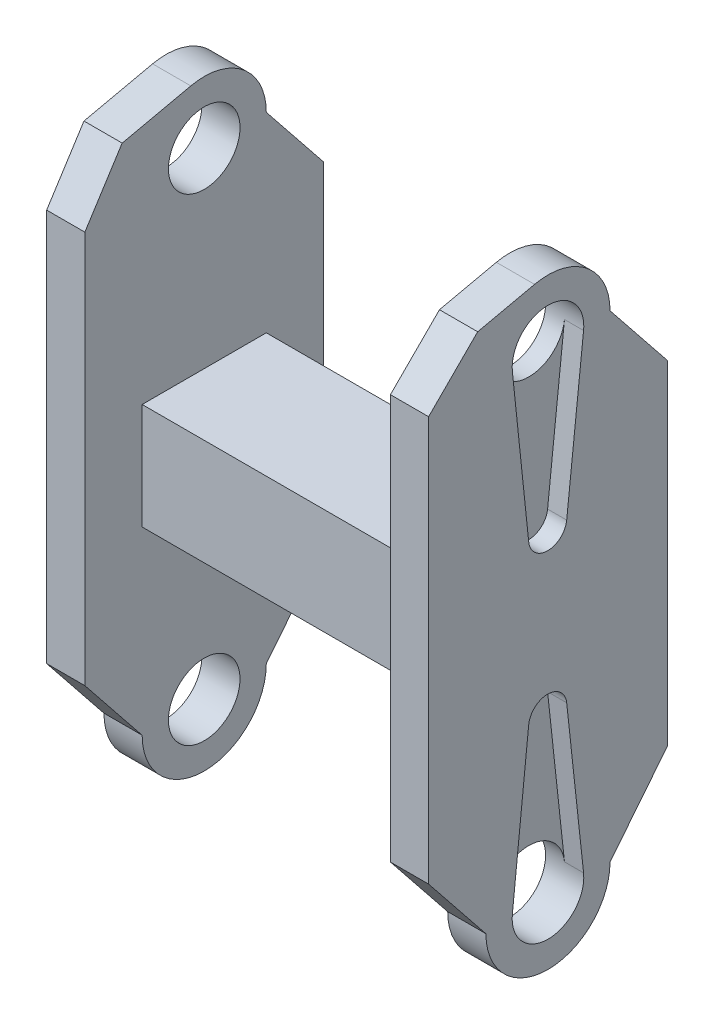
ISO-10303-21;
HEADER;
FILE_DESCRIPTION(('STEP AP214'),'2;1');
FILE_NAME('part.step','',(''),(''),'','','');
FILE_SCHEMA(('AUTOMOTIVE_DESIGN { 1 0 10303 214 1 1 1 1 }'));
ENDSEC;
DATA;
#1=APPLICATION_CONTEXT('core data for automotive mechanical design processes');
#2=APPLICATION_PROTOCOL_DEFINITION('international standard','automotive_design',2000,#1);
#3=PRODUCT_CONTEXT('',#1,'mechanical');
#4=PRODUCT('Part','Part','',(#3));
#5=PRODUCT_RELATED_PRODUCT_CATEGORY('part','',(#4));
#6=PRODUCT_DEFINITION_FORMATION('','',#4);
#7=PRODUCT_DEFINITION_CONTEXT('part definition',#1,'design');
#8=PRODUCT_DEFINITION('design','',#6,#7);
#9=PRODUCT_DEFINITION_SHAPE('','',#8);
#10=(LENGTH_UNIT() NAMED_UNIT(*) SI_UNIT(.MILLI.,.METRE.));
#11=(NAMED_UNIT(*) PLANE_ANGLE_UNIT() SI_UNIT($,.RADIAN.));
#12=(NAMED_UNIT(*) SI_UNIT($,.STERADIAN.) SOLID_ANGLE_UNIT());
#13=UNCERTAINTY_MEASURE_WITH_UNIT(LENGTH_MEASURE(1.E-05),#10,'distance_accuracy_value','');
#14=(GEOMETRIC_REPRESENTATION_CONTEXT(3) GLOBAL_UNCERTAINTY_ASSIGNED_CONTEXT((#13)) GLOBAL_UNIT_ASSIGNED_CONTEXT((#10,
#11,#12)) REPRESENTATION_CONTEXT('',''));
#15=CARTESIAN_POINT('',(0.,0.,0.));
#16=DIRECTION('',(0.,0.,1.));
#17=DIRECTION('',(1.,0.,0.));
#18=AXIS2_PLACEMENT_3D('',#15,#16,#17);
#19=CARTESIAN_POINT('',(-16.,25.,6.5));
#20=DIRECTION('',(-1.,0.,0.));
#21=DIRECTION('',(0.,0.,1.));
#22=AXIS2_PLACEMENT_3D('',#19,#20,#21);
#23=CYLINDRICAL_SURFACE('',#22,6.5);
#24=DIRECTION('',(-1.,0.,0.));
#25=VECTOR('',#24,1.);
#26=CARTESIAN_POINT('',(-16.,31.3465184269468,7.9041737272948));
#27=LINE('',#26,#25);
#28=CARTESIAN_POINT('',(-16.,31.3465184269468,7.9041737272948));
#29=VERTEX_POINT('',#28);
#30=CARTESIAN_POINT('',(-20.,31.3465184269468,7.9041737272948));
#31=VERTEX_POINT('',#30);
#32=EDGE_CURVE('E233',#29,#31,#27,.T.);
#33=ORIENTED_EDGE('',*,*,#32,.F.);
#34=CARTESIAN_POINT('',(-16.,25.,6.5));
#35=DIRECTION('',(1.,0.,0.));
#36=DIRECTION('',(0.,0.,1.));
#37=AXIS2_PLACEMENT_3D('',#34,#35,#36);
#38=CIRCLE('',#37,6.5);
#39=CARTESIAN_POINT('',(-16.,25.,0.));
#40=VERTEX_POINT('',#39);
#41=EDGE_CURVE('E243',#40,#29,#38,.T.);
#42=ORIENTED_EDGE('',*,*,#41,.F.);
#43=DIRECTION('',(-1.,0.,0.));
#44=VECTOR('',#43,1.);
#45=CARTESIAN_POINT('',(-20.,25.,0.));
#46=LINE('',#45,#44);
#47=CARTESIAN_POINT('',(-20.,25.,0.));
#48=VERTEX_POINT('',#47);
#49=EDGE_CURVE('E284',#40,#48,#46,.T.);
#50=ORIENTED_EDGE('',*,*,#49,.T.);
#51=CARTESIAN_POINT('',(-20.,25.,6.5));
#52=DIRECTION('',(1.,0.,0.));
#53=DIRECTION('',(0.,0.,1.));
#54=AXIS2_PLACEMENT_3D('',#51,#52,#53);
#55=CIRCLE('',#54,6.5);
#56=EDGE_CURVE('E245',#48,#31,#55,.T.);
#57=ORIENTED_EDGE('',*,*,#56,.T.);
#58=EDGE_LOOP('',(#33,#42,#50,#57));
#59=FACE_BOUND('',#58,.T.);
#60=ADVANCED_FACE('F36',(#59),#23,.T.);
#61=CARTESIAN_POINT('',(0.,0.,0.));
#62=DIRECTION('',(0.,0.,1.));
#63=DIRECTION('',(1.,0.,0.));
#64=AXIS2_PLACEMENT_3D('',#61,#62,#63);
#65=PLANE('',#64);
#66=DIRECTION('',(0.,-1.,0.));
#67=VECTOR('',#66,1.);
#68=CARTESIAN_POINT('',(-16.,25.,0.));
#69=LINE('',#68,#67);
#70=CARTESIAN_POINT('',(-16.,5.00000000000001,0.));
#71=VERTEX_POINT('',#70);
#72=CARTESIAN_POINT('',(-16.,-6.11298482293423,0.));
#73=VERTEX_POINT('',#72);
#74=EDGE_CURVE('E353',#71,#73,#69,.T.);
#75=ORIENTED_EDGE('',*,*,#74,.F.);
#76=DIRECTION('',(-1.,0.,0.));
#77=VECTOR('',#76,1.);
#78=CARTESIAN_POINT('',(-16.,5.,0.));
#79=LINE('',#78,#77);
#80=CARTESIAN_POINT('',(16.,5.,0.));
#81=VERTEX_POINT('',#80);
#82=EDGE_CURVE('E281',#81,#71,#79,.T.);
#83=ORIENTED_EDGE('',*,*,#82,.F.);
#84=DIRECTION('',(0.,-1.,0.));
#85=VECTOR('',#84,1.);
#86=CARTESIAN_POINT('',(16.,25.,0.));
#87=LINE('',#86,#85);
#88=CARTESIAN_POINT('',(16.,-6.11298482293422,0.));
#89=VERTEX_POINT('',#88);
#90=EDGE_CURVE('E387',#81,#89,#87,.T.);
#91=ORIENTED_EDGE('',*,*,#90,.T.);
#92=DIRECTION('',(1.,0.,0.));
#93=VECTOR('',#92,1.);
#94=CARTESIAN_POINT('',(-16.,-6.11298482293423,0.));
#95=LINE('',#94,#93);
#96=EDGE_CURVE('E289',#73,#89,#95,.T.);
#97=ORIENTED_EDGE('',*,*,#96,.F.);
#98=EDGE_LOOP('',(#75,#83,#91,#97));
#99=FACE_BOUND('',#98,.T.);
#100=ADVANCED_FACE('F532',(#99),#65,.F.);
#101=CARTESIAN_POINT('',(-16.,5.,13.));
#102=DIRECTION('',(0.,-1.,0.));
#103=DIRECTION('',(0.,0.,-1.));
#104=AXIS2_PLACEMENT_3D('',#101,#102,#103);
#105=PLANE('',#104);
#106=ORIENTED_EDGE('',*,*,#82,.T.);
#107=DIRECTION('',(0.,0.,-1.));
#108=VECTOR('',#107,1.);
#109=CARTESIAN_POINT('',(-16.,5.,13.));
#110=LINE('',#109,#108);
#111=CARTESIAN_POINT('',(-16.,5.,13.));
#112=VERTEX_POINT('',#111);
#113=EDGE_CURVE('E299',#112,#71,#110,.T.);
#114=ORIENTED_EDGE('',*,*,#113,.F.);
#115=DIRECTION('',(-1.,0.,0.));
#116=VECTOR('',#115,1.);
#117=CARTESIAN_POINT('',(-16.,5.,13.));
#118=LINE('',#117,#116);
#119=CARTESIAN_POINT('',(16.,5.,13.));
#120=VERTEX_POINT('',#119);
#121=EDGE_CURVE('E267',#120,#112,#118,.T.);
#122=ORIENTED_EDGE('',*,*,#121,.F.);
#123=DIRECTION('',(0.,0.,-1.));
#124=VECTOR('',#123,1.);
#125=CARTESIAN_POINT('',(16.,5.,13.));
#126=LINE('',#125,#124);
#127=EDGE_CURVE('E302',#120,#81,#126,.T.);
#128=ORIENTED_EDGE('',*,*,#127,.T.);
#129=EDGE_LOOP('',(#106,#114,#122,#128));
#130=FACE_BOUND('',#129,.T.);
#131=ADVANCED_FACE('F539',(#130),#105,.F.);
#132=CARTESIAN_POINT('',(-20.,-25.,13.));
#133=DIRECTION('',(1.,0.,0.));
#134=DIRECTION('',(0.,0.,-1.));
#135=AXIS2_PLACEMENT_3D('',#132,#133,#134);
#136=PLANE('',#135);
#137=DIRECTION('',(0.,-1.,0.));
#138=VECTOR('',#137,1.);
#139=CARTESIAN_POINT('',(-20.,17.5,19.));
#140=LINE('',#139,#138);
#141=CARTESIAN_POINT('',(-20.,23.6308944576838,19.));
#142=VERTEX_POINT('',#141);
#143=CARTESIAN_POINT('',(-20.,-17.5,19.));
#144=VERTEX_POINT('',#143);
#145=EDGE_CURVE('E331',#142,#144,#140,.T.);
#146=ORIENTED_EDGE('',*,*,#145,.F.);
#147=DIRECTION('',(0.,-0.843164150946709,0.537656223397735));
#148=VECTOR('',#147,1.);
#149=CARTESIAN_POINT('',(-20.,23.6308944576838,19.));
#150=LINE('',#149,#148);
#151=CARTESIAN_POINT('',(-20.,29.7556623647619,15.094450198802));
#152=VERTEX_POINT('',#151);
#153=EDGE_CURVE('E59',#142,#152,#150,.F.);
#154=ORIENTED_EDGE('',*,*,#153,.T.);
#155=DIRECTION('',(0.,-0.216026727276123,0.976387450299505));
#156=VECTOR('',#155,1.);
#157=CARTESIAN_POINT('',(-20.,28.8915554556574,19.));
#158=LINE('',#157,#156);
#159=EDGE_CURVE('E238',#31,#152,#158,.T.);
#160=ORIENTED_EDGE('',*,*,#159,.F.);
#161=ORIENTED_EDGE('',*,*,#56,.F.);
#162=DIRECTION('',(0.,0.78086880944303,0.624695047554425));
#163=VECTOR('',#162,1.);
#164=CARTESIAN_POINT('',(-20.,25.,0.));
#165=LINE('',#164,#163);
#166=CARTESIAN_POINT('',(-20.,17.5,-6.00000000000001));
#167=VERTEX_POINT('',#166);
#168=EDGE_CURVE('E352',#167,#48,#165,.T.);
#169=ORIENTED_EDGE('',*,*,#168,.F.);
#170=DIRECTION('',(0.,1.,0.));
#171=VECTOR('',#170,1.);
#172=CARTESIAN_POINT('',(-20.,17.5,-6.00000000000001));
#173=LINE('',#172,#171);
#174=CARTESIAN_POINT('',(-20.,-17.5,-6.00000000000001));
#175=VERTEX_POINT('',#174);
#176=EDGE_CURVE('E363',#175,#167,#173,.T.);
#177=ORIENTED_EDGE('',*,*,#176,.F.);
#178=DIRECTION('',(0.,0.78086880944303,-0.624695047554425));
#179=VECTOR('',#178,1.);
#180=CARTESIAN_POINT('',(-20.,-25.,0.));
#181=LINE('',#180,#179);
#182=CARTESIAN_POINT('',(-20.,-25.,0.));
#183=VERTEX_POINT('',#182);
#184=EDGE_CURVE('E355',#183,#175,#181,.T.);
#185=ORIENTED_EDGE('',*,*,#184,.F.);
#186=CARTESIAN_POINT('',(-20.,-25.,6.5));
#187=DIRECTION('',(1.,0.,0.));
#188=DIRECTION('',(0.,0.,-1.));
#189=AXIS2_PLACEMENT_3D('',#186,#187,#188);
#190=CIRCLE('',#189,6.5);
#191=CARTESIAN_POINT('',(-20.,-25.,13.));
#192=VERTEX_POINT('',#191);
#193=EDGE_CURVE('E434',#192,#183,#190,.T.);
#194=ORIENTED_EDGE('',*,*,#193,.F.);
#195=DIRECTION('',(0.,-0.78086880944303,-0.624695047554425));
#196=VECTOR('',#195,1.);
#197=CARTESIAN_POINT('',(-20.,-25.,13.));
#198=LINE('',#197,#196);
#199=EDGE_CURVE('E340',#144,#192,#198,.T.);
#200=ORIENTED_EDGE('',*,*,#199,.F.);
#201=EDGE_LOOP('',(#146,#154,#160,#161,#169,#177,#185,#194,#200));
#202=FACE_BOUND('',#201,.T.);
#203=CARTESIAN_POINT('',(-20.,-25.,6.5));
#204=DIRECTION('',(-1.,0.,0.));
#205=DIRECTION('',(0.,0.,1.));
#206=AXIS2_PLACEMENT_3D('',#203,#204,#205);
#207=CIRCLE('',#206,3.75);
#208=CARTESIAN_POINT('',(-20.,-25.,10.25));
#209=VERTEX_POINT('',#208);
#210=EDGE_CURVE('E314',#209,#209,#207,.T.);
#211=ORIENTED_EDGE('',*,*,#210,.F.);
#212=EDGE_LOOP('',(#211));
#213=FACE_BOUND('',#212,.T.);
#214=CARTESIAN_POINT('',(-20.,25.,6.5));
#215=DIRECTION('',(-1.,0.,0.));
#216=DIRECTION('',(0.,0.,1.));
#217=AXIS2_PLACEMENT_3D('',#214,#215,#216);
#218=CIRCLE('',#217,3.75);
#219=CARTESIAN_POINT('',(-20.,25.,10.25));
#220=VERTEX_POINT('',#219);
#221=EDGE_CURVE('E450',#220,#220,#218,.T.);
#222=ORIENTED_EDGE('',*,*,#221,.F.);
#223=EDGE_LOOP('',(#222));
#224=FACE_BOUND('',#223,.T.);
#225=ADVANCED_FACE('F336',(#202,#213,#224),#136,.F.);
#226=CARTESIAN_POINT('',(-16.,-25.,13.));
#227=DIRECTION('',(-1.,0.,0.));
#228=DIRECTION('',(0.,0.,1.));
#229=AXIS2_PLACEMENT_3D('',#226,#227,#228);
#230=PLANE('',#229);
#231=DIRECTION('',(0.,-0.216026727276123,0.976387450299505));
#232=VECTOR('',#231,1.);
#233=CARTESIAN_POINT('',(-16.,28.8915554556574,19.));
#234=LINE('',#233,#232);
#235=CARTESIAN_POINT('',(-16.,29.7556623647619,15.094450198802));
#236=VERTEX_POINT('',#235);
#237=EDGE_CURVE('E230',#29,#236,#234,.T.);
#238=ORIENTED_EDGE('',*,*,#237,.T.);
#239=DIRECTION('',(0.,0.843164150946709,-0.537656223397735));
#240=VECTOR('',#239,1.);
#241=CARTESIAN_POINT('',(-16.,23.6308944576838,19.));
#242=LINE('',#241,#240);
#243=CARTESIAN_POINT('',(-16.,23.6308944576838,19.));
#244=VERTEX_POINT('',#243);
#245=EDGE_CURVE('E11',#236,#244,#242,.F.);
#246=ORIENTED_EDGE('',*,*,#245,.T.);
#247=DIRECTION('',(0.,-1.,0.));
#248=VECTOR('',#247,1.);
#249=CARTESIAN_POINT('',(-16.,17.5,19.));
#250=LINE('',#249,#248);
#251=CARTESIAN_POINT('',(-16.,-17.5,19.));
#252=VERTEX_POINT('',#251);
#253=EDGE_CURVE('E333',#244,#252,#250,.T.);
#254=ORIENTED_EDGE('',*,*,#253,.T.);
#255=DIRECTION('',(0.,-0.78086880944303,-0.624695047554425));
#256=VECTOR('',#255,1.);
#257=CARTESIAN_POINT('',(-16.,-25.,13.));
#258=LINE('',#257,#256);
#259=CARTESIAN_POINT('',(-16.,-25.,13.));
#260=VERTEX_POINT('',#259);
#261=EDGE_CURVE('E344',#252,#260,#258,.T.);
#262=ORIENTED_EDGE('',*,*,#261,.T.);
#263=CARTESIAN_POINT('',(-16.,-25.,6.5));
#264=DIRECTION('',(1.,0.,0.));
#265=DIRECTION('',(0.,0.,-1.));
#266=AXIS2_PLACEMENT_3D('',#263,#264,#265);
#267=CIRCLE('',#266,6.5);
#268=CARTESIAN_POINT('',(-16.,-25.,0.));
#269=VERTEX_POINT('',#268);
#270=EDGE_CURVE('E441',#260,#269,#267,.T.);
#271=ORIENTED_EDGE('',*,*,#270,.T.);
#272=DIRECTION('',(0.,0.78086880944303,-0.624695047554425));
#273=VECTOR('',#272,1.);
#274=CARTESIAN_POINT('',(-16.,-25.,0.));
#275=LINE('',#274,#273);
#276=CARTESIAN_POINT('',(-16.,-17.5,-6.00000000000001));
#277=VERTEX_POINT('',#276);
#278=EDGE_CURVE('E359',#269,#277,#275,.T.);
#279=ORIENTED_EDGE('',*,*,#278,.T.);
#280=DIRECTION('',(0.,1.,0.));
#281=VECTOR('',#280,1.);
#282=CARTESIAN_POINT('',(-16.,17.5,-6.00000000000001));
#283=LINE('',#282,#281);
#284=CARTESIAN_POINT('',(-16.,17.5,-6.00000000000001));
#285=VERTEX_POINT('',#284);
#286=EDGE_CURVE('E357',#277,#285,#283,.T.);
#287=ORIENTED_EDGE('',*,*,#286,.T.);
#288=DIRECTION('',(0.,0.78086880944303,0.624695047554425));
#289=VECTOR('',#288,1.);
#290=CARTESIAN_POINT('',(-16.,25.,0.));
#291=LINE('',#290,#289);
#292=EDGE_CURVE('E251',#285,#40,#291,.T.);
#293=ORIENTED_EDGE('',*,*,#292,.T.);
#294=ORIENTED_EDGE('',*,*,#41,.T.);
#295=EDGE_LOOP('',(#238,#246,#254,#262,#271,#279,#287,#293,#294));
#296=FACE_BOUND('',#295,.T.);
#297=DIRECTION('',(0.,0.,-1.));
#298=VECTOR('',#297,1.);
#299=CARTESIAN_POINT('',(-16.,-6.11298482293423,13.));
#300=LINE('',#299,#298);
#301=CARTESIAN_POINT('',(-16.,-6.11298482293423,13.));
#302=VERTEX_POINT('',#301);
#303=EDGE_CURVE('E296',#302,#73,#300,.T.);
#304=ORIENTED_EDGE('',*,*,#303,.F.);
#305=DIRECTION('',(0.,1.,0.));
#306=VECTOR('',#305,1.);
#307=CARTESIAN_POINT('',(-16.,25.,13.));
#308=LINE('',#307,#306);
#309=EDGE_CURVE('E341',#302,#112,#308,.T.);
#310=ORIENTED_EDGE('',*,*,#309,.T.);
#311=ORIENTED_EDGE('',*,*,#113,.T.);
#312=ORIENTED_EDGE('',*,*,#74,.T.);
#313=EDGE_LOOP('',(#304,#310,#311,#312));
#314=FACE_BOUND('',#313,.T.);
#315=CARTESIAN_POINT('',(-16.,-25.,6.5));
#316=DIRECTION('',(-1.,0.,0.));
#317=DIRECTION('',(0.,0.,1.));
#318=AXIS2_PLACEMENT_3D('',#315,#316,#317);
#319=CIRCLE('',#318,3.75);
#320=CARTESIAN_POINT('',(-16.,-25.,10.25));
#321=VERTEX_POINT('',#320);
#322=EDGE_CURVE('E311',#321,#321,#319,.T.);
#323=ORIENTED_EDGE('',*,*,#322,.T.);
#324=EDGE_LOOP('',(#323));
#325=FACE_BOUND('',#324,.T.);
#326=CARTESIAN_POINT('',(-16.,25.,6.5));
#327=DIRECTION('',(-1.,0.,0.));
#328=DIRECTION('',(0.,-1.,0.));
#329=AXIS2_PLACEMENT_3D('',#326,#327,#328);
#330=CIRCLE('',#329,3.75);
#331=CARTESIAN_POINT('',(-16.,21.25,6.5));
#332=VERTEX_POINT('',#331);
#333=EDGE_CURVE('E455',#332,#332,#330,.T.);
#334=ORIENTED_EDGE('',*,*,#333,.T.);
#335=EDGE_LOOP('',(#334));
#336=FACE_BOUND('',#335,.T.);
#337=ADVANCED_FACE('F248',(#296,#314,#325,#336),#230,.F.);
#338=CARTESIAN_POINT('',(-16.,-6.11298482293423,13.));
#339=DIRECTION('',(0.,1.,0.));
#340=DIRECTION('',(0.,0.,1.));
#341=AXIS2_PLACEMENT_3D('',#338,#339,#340);
#342=PLANE('',#341);
#343=ORIENTED_EDGE('',*,*,#96,.T.);
#344=DIRECTION('',(0.,0.,-1.));
#345=VECTOR('',#344,1.);
#346=CARTESIAN_POINT('',(16.,-6.11298482293423,13.));
#347=LINE('',#346,#345);
#348=CARTESIAN_POINT('',(16.,-6.11298482293423,13.));
#349=VERTEX_POINT('',#348);
#350=EDGE_CURVE('E278',#349,#89,#347,.T.);
#351=ORIENTED_EDGE('',*,*,#350,.F.);
#352=DIRECTION('',(1.,0.,0.));
#353=VECTOR('',#352,1.);
#354=CARTESIAN_POINT('',(-16.,-6.11298482293423,13.));
#355=LINE('',#354,#353);
#356=EDGE_CURVE('E273',#302,#349,#355,.T.);
#357=ORIENTED_EDGE('',*,*,#356,.F.);
#358=ORIENTED_EDGE('',*,*,#303,.T.);
#359=EDGE_LOOP('',(#343,#351,#357,#358));
#360=FACE_BOUND('',#359,.T.);
#361=ADVANCED_FACE('F516',(#360),#342,.F.);
#362=CARTESIAN_POINT('',(16.,-6.11298482293423,13.));
#363=DIRECTION('',(1.,0.,0.));
#364=DIRECTION('',(0.,1.,0.));
#365=AXIS2_PLACEMENT_3D('',#362,#363,#364);
#366=PLANE('',#365);
#367=DIRECTION('',(0.,-1.,0.));
#368=VECTOR('',#367,1.);
#369=CARTESIAN_POINT('',(16.,17.5,19.));
#370=LINE('',#369,#368);
#371=CARTESIAN_POINT('',(16.,24.8915554556574,19.));
#372=VERTEX_POINT('',#371);
#373=CARTESIAN_POINT('',(16.,-17.5,19.));
#374=VERTEX_POINT('',#373);
#375=EDGE_CURVE('E374',#372,#374,#370,.T.);
#376=ORIENTED_EDGE('',*,*,#375,.F.);
#377=DIRECTION('',(0.,-0.707106781186549,0.707106781186546));
#378=VECTOR('',#377,1.);
#379=CARTESIAN_POINT('',(16.,30.0279988343587,13.8635566212987));
#380=LINE('',#379,#378);
#381=CARTESIAN_POINT('',(16.,30.0279988343587,13.8635566212987));
#382=VERTEX_POINT('',#381);
#383=EDGE_CURVE('E321',#372,#382,#380,.F.);
#384=ORIENTED_EDGE('',*,*,#383,.T.);
#385=DIRECTION('',(0.,-0.216026727276123,0.976387450299505));
#386=VECTOR('',#385,1.);
#387=CARTESIAN_POINT('',(16.,28.8915554556574,19.));
#388=LINE('',#387,#386);
#389=CARTESIAN_POINT('',(16.,31.3465184269468,7.9041737272948));
#390=VERTEX_POINT('',#389);
#391=EDGE_CURVE('E591',#390,#382,#388,.T.);
#392=ORIENTED_EDGE('',*,*,#391,.F.);
#393=CARTESIAN_POINT('',(16.,25.,6.5));
#394=DIRECTION('',(1.,0.,0.));
#395=DIRECTION('',(0.,0.,1.));
#396=AXIS2_PLACEMENT_3D('',#393,#394,#395);
#397=CIRCLE('',#396,6.5);
#398=CARTESIAN_POINT('',(16.,25.,0.));
#399=VERTEX_POINT('',#398);
#400=EDGE_CURVE('E256',#399,#390,#397,.T.);
#401=ORIENTED_EDGE('',*,*,#400,.F.);
#402=DIRECTION('',(0.,0.78086880944303,0.624695047554425));
#403=VECTOR('',#402,1.);
#404=CARTESIAN_POINT('',(16.,25.,0.));
#405=LINE('',#404,#403);
#406=CARTESIAN_POINT('',(16.,17.5,-6.00000000000001));
#407=VERTEX_POINT('',#406);
#408=EDGE_CURVE('E396',#407,#399,#405,.T.);
#409=ORIENTED_EDGE('',*,*,#408,.F.);
#410=DIRECTION('',(0.,1.,0.));
#411=VECTOR('',#410,1.);
#412=CARTESIAN_POINT('',(16.,17.5,-6.00000000000001));
#413=LINE('',#412,#411);
#414=CARTESIAN_POINT('',(16.,-17.5,-6.00000000000001));
#415=VERTEX_POINT('',#414);
#416=EDGE_CURVE('E393',#415,#407,#413,.T.);
#417=ORIENTED_EDGE('',*,*,#416,.F.);
#418=DIRECTION('',(0.,0.78086880944303,-0.624695047554425));
#419=VECTOR('',#418,1.);
#420=CARTESIAN_POINT('',(16.,-25.,0.));
#421=LINE('',#420,#419);
#422=CARTESIAN_POINT('',(16.,-25.,0.));
#423=VERTEX_POINT('',#422);
#424=EDGE_CURVE('E389',#423,#415,#421,.T.);
#425=ORIENTED_EDGE('',*,*,#424,.F.);
#426=CARTESIAN_POINT('',(16.,-25.,6.5));
#427=DIRECTION('',(1.,0.,0.));
#428=DIRECTION('',(0.,0.,-1.));
#429=AXIS2_PLACEMENT_3D('',#426,#427,#428);
#430=CIRCLE('',#429,6.5);
#431=CARTESIAN_POINT('',(16.,-25.,13.));
#432=VERTEX_POINT('',#431);
#433=EDGE_CURVE('E447',#432,#423,#430,.T.);
#434=ORIENTED_EDGE('',*,*,#433,.F.);
#435=DIRECTION('',(0.,-0.78086880944303,-0.624695047554425));
#436=VECTOR('',#435,1.);
#437=CARTESIAN_POINT('',(16.,-25.,13.));
#438=LINE('',#437,#436);
#439=EDGE_CURVE('E377',#374,#432,#438,.T.);
#440=ORIENTED_EDGE('',*,*,#439,.F.);
#441=EDGE_LOOP('',(#376,#384,#392,#401,#409,#417,#425,#434,#440));
#442=FACE_BOUND('',#441,.T.);
#443=ORIENTED_EDGE('',*,*,#127,.F.);
#444=DIRECTION('',(0.,1.,0.));
#445=VECTOR('',#444,1.);
#446=CARTESIAN_POINT('',(16.,25.,13.));
#447=LINE('',#446,#445);
#448=EDGE_CURVE('E372',#349,#120,#447,.T.);
#449=ORIENTED_EDGE('',*,*,#448,.F.);
#450=ORIENTED_EDGE('',*,*,#350,.T.);
#451=ORIENTED_EDGE('',*,*,#90,.F.);
#452=EDGE_LOOP('',(#443,#449,#450,#451));
#453=FACE_BOUND('',#452,.T.);
#454=CARTESIAN_POINT('',(16.,-25.,6.5));
#455=DIRECTION('',(1.,0.,0.));
#456=DIRECTION('',(0.,1.,0.));
#457=AXIS2_PLACEMENT_3D('',#454,#455,#456);
#458=CIRCLE('',#457,3.75);
#459=CARTESIAN_POINT('',(16.,-21.25,6.5));
#460=VERTEX_POINT('',#459);
#461=EDGE_CURVE('E306',#460,#460,#458,.T.);
#462=ORIENTED_EDGE('',*,*,#461,.T.);
#463=EDGE_LOOP('',(#462));
#464=FACE_BOUND('',#463,.T.);
#465=CARTESIAN_POINT('',(16.,25.,6.5));
#466=DIRECTION('',(1.,0.,0.));
#467=DIRECTION('',(0.,0.,-1.));
#468=AXIS2_PLACEMENT_3D('',#465,#466,#467);
#469=CIRCLE('',#468,3.75);
#470=CARTESIAN_POINT('',(16.,25.,2.75));
#471=VERTEX_POINT('',#470);
#472=EDGE_CURVE('E459',#471,#471,#469,.T.);
#473=ORIENTED_EDGE('',*,*,#472,.T.);
#474=EDGE_LOOP('',(#473));
#475=FACE_BOUND('',#474,.T.);
#476=ADVANCED_FACE('F514',(#442,#453,#464,#475),#366,.F.);
#477=CARTESIAN_POINT('',(20.,-25.,13.));
#478=DIRECTION('',(-1.,0.,0.));
#479=DIRECTION('',(0.,0.,1.));
#480=AXIS2_PLACEMENT_3D('',#477,#478,#479);
#481=PLANE('',#480);
#482=DIRECTION('',(0.,-0.216026727276123,0.976387450299505));
#483=VECTOR('',#482,1.);
#484=CARTESIAN_POINT('',(20.,28.8915554556574,19.));
#485=LINE('',#484,#483);
#486=CARTESIAN_POINT('',(20.,31.3465184269468,7.9041737272948));
#487=VERTEX_POINT('',#486);
#488=CARTESIAN_POINT('',(20.,30.0279988343587,13.8635566212987));
#489=VERTEX_POINT('',#488);
#490=EDGE_CURVE('E246',#487,#489,#485,.T.);
#491=ORIENTED_EDGE('',*,*,#490,.T.);
#492=DIRECTION('',(0.,0.707106781186549,-0.707106781186546));
#493=VECTOR('',#492,1.);
#494=CARTESIAN_POINT('',(20.,30.0279988343587,13.8635566212987));
#495=LINE('',#494,#493);
#496=CARTESIAN_POINT('',(20.,24.8915554556574,19.));
#497=VERTEX_POINT('',#496);
#498=EDGE_CURVE('E317',#489,#497,#495,.F.);
#499=ORIENTED_EDGE('',*,*,#498,.T.);
#500=DIRECTION('',(0.,-1.,0.));
#501=VECTOR('',#500,1.);
#502=CARTESIAN_POINT('',(20.,17.5,19.));
#503=LINE('',#502,#501);
#504=CARTESIAN_POINT('',(20.,-17.5,19.));
#505=VERTEX_POINT('',#504);
#506=EDGE_CURVE('E369',#497,#505,#503,.T.);
#507=ORIENTED_EDGE('',*,*,#506,.T.);
#508=DIRECTION('',(0.,-0.78086880944303,-0.624695047554425));
#509=VECTOR('',#508,1.);
#510=CARTESIAN_POINT('',(20.,-25.,13.));
#511=LINE('',#510,#509);
#512=CARTESIAN_POINT('',(20.,-25.,13.));
#513=VERTEX_POINT('',#512);
#514=EDGE_CURVE('E375',#505,#513,#511,.T.);
#515=ORIENTED_EDGE('',*,*,#514,.T.);
#516=CARTESIAN_POINT('',(20.,-25.,6.5));
#517=DIRECTION('',(1.,0.,0.));
#518=DIRECTION('',(0.,0.,-1.));
#519=AXIS2_PLACEMENT_3D('',#516,#517,#518);
#520=CIRCLE('',#519,6.5);
#521=CARTESIAN_POINT('',(20.,-25.,0.));
#522=VERTEX_POINT('',#521);
#523=EDGE_CURVE('E444',#513,#522,#520,.T.);
#524=ORIENTED_EDGE('',*,*,#523,.T.);
#525=DIRECTION('',(0.,0.78086880944303,-0.624695047554425));
#526=VECTOR('',#525,1.);
#527=CARTESIAN_POINT('',(20.,-25.,0.));
#528=LINE('',#527,#526);
#529=CARTESIAN_POINT('',(20.,-17.5,-6.00000000000001));
#530=VERTEX_POINT('',#529);
#531=EDGE_CURVE('E386',#522,#530,#528,.T.);
#532=ORIENTED_EDGE('',*,*,#531,.T.);
#533=DIRECTION('',(0.,1.,0.));
#534=VECTOR('',#533,1.);
#535=CARTESIAN_POINT('',(20.,17.5,-6.00000000000001));
#536=LINE('',#535,#534);
#537=CARTESIAN_POINT('',(20.,17.5,-6.00000000000001));
#538=VERTEX_POINT('',#537);
#539=EDGE_CURVE('E401',#530,#538,#536,.T.);
#540=ORIENTED_EDGE('',*,*,#539,.T.);
#541=DIRECTION('',(0.,0.78086880944303,0.624695047554425));
#542=VECTOR('',#541,1.);
#543=CARTESIAN_POINT('',(20.,25.,0.));
#544=LINE('',#543,#542);
#545=CARTESIAN_POINT('',(20.,25.,0.));
#546=VERTEX_POINT('',#545);
#547=EDGE_CURVE('E390',#538,#546,#544,.T.);
#548=ORIENTED_EDGE('',*,*,#547,.T.);
#549=CARTESIAN_POINT('',(20.,25.,6.5));
#550=DIRECTION('',(1.,0.,0.));
#551=DIRECTION('',(0.,0.,1.));
#552=AXIS2_PLACEMENT_3D('',#549,#550,#551);
#553=CIRCLE('',#552,6.5);
#554=EDGE_CURVE('E253',#546,#487,#553,.T.);
#555=ORIENTED_EDGE('',*,*,#554,.T.);
#556=EDGE_LOOP('',(#491,#499,#507,#515,#524,#532,#540,#548,#555));
#557=FACE_BOUND('',#556,.T.);
#558=DIRECTION('',(0.,-0.994541589334938,0.104340917588142));
#559=VECTOR('',#558,1.);
#560=CARTESIAN_POINT('',(20.,-8.29134283582245,8.51761635847312));
#561=LINE('',#560,#559);
#562=CARTESIAN_POINT('',(20.,-8.29134283582245,8.51761635847312));
#563=VERTEX_POINT('',#562);
#564=CARTESIAN_POINT('',(20.,-24.6087215590445,10.229530960006));
#565=VERTEX_POINT('',#564);
#566=EDGE_CURVE('E424',#563,#565,#561,.T.);
#567=ORIENTED_EDGE('',*,*,#566,.F.);
#568=CARTESIAN_POINT('',(20.,-8.50002467099873,6.52853317980324));
#569=DIRECTION('',(1.,0.,0.));
#570=DIRECTION('',(0.,0.,-1.));
#571=AXIS2_PLACEMENT_3D('',#568,#569,#570);
#572=CIRCLE('',#571,2.);
#573=CARTESIAN_POINT('',(20.,-8.28446471626497,4.54018363661041));
#574=VERTEX_POINT('',#573);
#575=EDGE_CURVE('E309',#574,#563,#572,.T.);
#576=ORIENTED_EDGE('',*,*,#575,.F.);
#577=DIRECTION('',(0.,0.994174771596421,0.107779977366879));
#578=VECTOR('',#577,1.);
#579=CARTESIAN_POINT('',(20.,-8.28446471626497,4.54018363661041));
#580=LINE('',#579,#578);
#581=CARTESIAN_POINT('',(20.,-24.5958250848742,2.77184460651342));
#582=VERTEX_POINT('',#581);
#583=EDGE_CURVE('E416',#582,#574,#580,.T.);
#584=ORIENTED_EDGE('',*,*,#583,.F.);
#585=CARTESIAN_POINT('',(20.,-25.,6.5));
#586=DIRECTION('',(1.,0.,0.));
#587=DIRECTION('',(0.,0.,-1.));
#588=AXIS2_PLACEMENT_3D('',#585,#586,#587);
#589=CIRCLE('',#588,3.75);
#590=EDGE_CURVE('E427',#565,#582,#589,.T.);
#591=ORIENTED_EDGE('',*,*,#590,.F.);
#592=EDGE_LOOP('',(#567,#576,#584,#591));
#593=FACE_BOUND('',#592,.T.);
#594=DIRECTION('',(0.,-0.994541589334938,-0.104340917588143));
#595=VECTOR('',#594,1.);
#596=CARTESIAN_POINT('',(20.,24.6087215590445,10.229530960006));
#597=LINE('',#596,#595);
#598=CARTESIAN_POINT('',(20.,24.6087215590445,10.229530960006));
#599=VERTEX_POINT('',#598);
#600=CARTESIAN_POINT('',(20.,8.29134283582245,8.51761635847312));
#601=VERTEX_POINT('',#600);
#602=EDGE_CURVE('E475',#599,#601,#597,.T.);
#603=ORIENTED_EDGE('',*,*,#602,.F.);
#604=CARTESIAN_POINT('',(20.,25.,6.5));
#605=DIRECTION('',(1.,0.,0.));
#606=DIRECTION('',(0.,0.,-1.));
#607=AXIS2_PLACEMENT_3D('',#604,#605,#606);
#608=CIRCLE('',#607,3.75);
#609=CARTESIAN_POINT('',(20.,24.5958250848742,2.77184460651343));
#610=VERTEX_POINT('',#609);
#611=EDGE_CURVE('E462',#610,#599,#608,.T.);
#612=ORIENTED_EDGE('',*,*,#611,.F.);
#613=DIRECTION('',(0.,0.994174771596421,-0.107779977366878));
#614=VECTOR('',#613,1.);
#615=CARTESIAN_POINT('',(20.,24.5958250848742,2.77184460651343));
#616=LINE('',#615,#614);
#617=CARTESIAN_POINT('',(20.,8.28446471626497,4.5401836366104));
#618=VERTEX_POINT('',#617);
#619=EDGE_CURVE('E468',#618,#610,#616,.T.);
#620=ORIENTED_EDGE('',*,*,#619,.F.);
#621=CARTESIAN_POINT('',(20.,8.50002467099873,6.52853317980324));
#622=DIRECTION('',(1.,0.,0.));
#623=DIRECTION('',(0.,0.,-1.));
#624=AXIS2_PLACEMENT_3D('',#621,#622,#623);
#625=CIRCLE('',#624,2.);
#626=EDGE_CURVE('E478',#601,#618,#625,.T.);
#627=ORIENTED_EDGE('',*,*,#626,.F.);
#628=EDGE_LOOP('',(#603,#612,#620,#627));
#629=FACE_BOUND('',#628,.T.);
#630=ADVANCED_FACE('F498',(#557,#593,#629),#481,.F.);
#631=CARTESIAN_POINT('',(0.,0.,13.));
#632=DIRECTION('',(0.,0.,1.));
#633=DIRECTION('',(1.,0.,0.));
#634=AXIS2_PLACEMENT_3D('',#631,#632,#633);
#635=PLANE('',#634);
#636=ORIENTED_EDGE('',*,*,#309,.F.);
#637=ORIENTED_EDGE('',*,*,#356,.T.);
#638=ORIENTED_EDGE('',*,*,#448,.T.);
#639=ORIENTED_EDGE('',*,*,#121,.T.);
#640=EDGE_LOOP('',(#636,#637,#638,#639));
#641=FACE_BOUND('',#640,.T.);
#642=ADVANCED_FACE('F523',(#641),#635,.T.);
#643=CARTESIAN_POINT('',(16.,25.,6.5));
#644=DIRECTION('',(1.,0.,0.));
#645=DIRECTION('',(0.,0.,-1.));
#646=AXIS2_PLACEMENT_3D('',#643,#644,#645);
#647=CYLINDRICAL_SURFACE('',#646,6.5);
#648=DIRECTION('',(1.,0.,0.));
#649=VECTOR('',#648,1.);
#650=CARTESIAN_POINT('',(16.,31.3465184269468,7.9041737272948));
#651=LINE('',#650,#649);
#652=EDGE_CURVE('E346',#390,#487,#651,.T.);
#653=ORIENTED_EDGE('',*,*,#652,.T.);
#654=ORIENTED_EDGE('',*,*,#554,.F.);
#655=DIRECTION('',(-1.,0.,0.));
#656=VECTOR('',#655,1.);
#657=CARTESIAN_POINT('',(16.,25.,0.));
#658=LINE('',#657,#656);
#659=EDGE_CURVE('E265',#546,#399,#658,.T.);
#660=ORIENTED_EDGE('',*,*,#659,.T.);
#661=ORIENTED_EDGE('',*,*,#400,.T.);
#662=EDGE_LOOP('',(#653,#654,#660,#661));
#663=FACE_BOUND('',#662,.T.);
#664=ADVANCED_FACE('F510',(#663),#647,.T.);
#665=CARTESIAN_POINT('',(18.,25.,6.5));
#666=DIRECTION('',(1.,0.,0.));
#667=DIRECTION('',(0.,0.,-1.));
#668=AXIS2_PLACEMENT_3D('',#665,#666,#667);
#669=CYLINDRICAL_SURFACE('',#668,3.75);
#670=ORIENTED_EDGE('',*,*,#611,.T.);
#671=DIRECTION('',(1.,0.,0.));
#672=VECTOR('',#671,1.);
#673=CARTESIAN_POINT('',(18.,24.6087215590445,10.229530960006));
#674=LINE('',#673,#672);
#675=CARTESIAN_POINT('',(18.,24.6087215590445,10.229530960006));
#676=VERTEX_POINT('',#675);
#677=EDGE_CURVE('E261',#676,#599,#674,.T.);
#678=ORIENTED_EDGE('',*,*,#677,.F.);
#679=CARTESIAN_POINT('',(18.,25.,6.5));
#680=DIRECTION('',(1.,0.,0.));
#681=DIRECTION('',(0.,0.,-1.));
#682=AXIS2_PLACEMENT_3D('',#679,#680,#681);
#683=CIRCLE('',#682,3.75);
#684=CARTESIAN_POINT('',(18.,24.5958250848742,2.77184460651343));
#685=VERTEX_POINT('',#684);
#686=EDGE_CURVE('E458',#676,#685,#683,.T.);
#687=ORIENTED_EDGE('',*,*,#686,.T.);
#688=DIRECTION('',(1.,0.,0.));
#689=VECTOR('',#688,1.);
#690=CARTESIAN_POINT('',(18.,24.5958250848742,2.77184460651343));
#691=LINE('',#690,#689);
#692=EDGE_CURVE('E258',#685,#610,#691,.T.);
#693=ORIENTED_EDGE('',*,*,#692,.T.);
#694=EDGE_LOOP('',(#670,#678,#687,#693));
#695=FACE_BOUND('',#694,.T.);
#696=ORIENTED_EDGE('',*,*,#472,.F.);
#697=EDGE_LOOP('',(#696));
#698=FACE_BOUND('',#697,.T.);
#699=ADVANCED_FACE('F507',(#695,#698),#669,.F.);
#700=CARTESIAN_POINT('',(18.,24.5958250848742,2.77184460651343));
#701=DIRECTION('',(0.,-0.107779977366878,-0.994174771596421));
#702=DIRECTION('',(0.,0.994174771596421,-0.107779977366878));
#703=AXIS2_PLACEMENT_3D('',#700,#701,#702);
#704=PLANE('',#703);
#705=ORIENTED_EDGE('',*,*,#619,.T.);
#706=ORIENTED_EDGE('',*,*,#692,.F.);
#707=DIRECTION('',(0.,0.994174771596421,-0.107779977366878));
#708=VECTOR('',#707,1.);
#709=CARTESIAN_POINT('',(18.,24.5958250848742,2.77184460651343));
#710=LINE('',#709,#708);
#711=CARTESIAN_POINT('',(18.,8.28446471626497,4.5401836366104));
#712=VERTEX_POINT('',#711);
#713=EDGE_CURVE('E471',#712,#685,#710,.T.);
#714=ORIENTED_EDGE('',*,*,#713,.F.);
#715=DIRECTION('',(1.,0.,0.));
#716=VECTOR('',#715,1.);
#717=CARTESIAN_POINT('',(18.,8.28446471626497,4.5401836366104));
#718=LINE('',#717,#716);
#719=EDGE_CURVE('E484',#712,#618,#718,.T.);
#720=ORIENTED_EDGE('',*,*,#719,.T.);
#721=EDGE_LOOP('',(#705,#706,#714,#720));
#722=FACE_BOUND('',#721,.T.);
#723=ADVANCED_FACE('F506',(#722),#704,.F.);
#724=CARTESIAN_POINT('',(18.,8.50002467099873,6.52853317980324));
#725=DIRECTION('',(1.,0.,0.));
#726=DIRECTION('',(0.,0.,-1.));
#727=AXIS2_PLACEMENT_3D('',#724,#725,#726);
#728=CYLINDRICAL_SURFACE('',#727,2.);
#729=ORIENTED_EDGE('',*,*,#626,.T.);
#730=ORIENTED_EDGE('',*,*,#719,.F.);
#731=CARTESIAN_POINT('',(18.,8.50002467099873,6.52853317980324));
#732=DIRECTION('',(1.,0.,0.));
#733=DIRECTION('',(0.,0.,-1.));
#734=AXIS2_PLACEMENT_3D('',#731,#732,#733);
#735=CIRCLE('',#734,2.);
#736=CARTESIAN_POINT('',(18.,8.29134283582245,8.51761635847312));
#737=VERTEX_POINT('',#736);
#738=EDGE_CURVE('E467',#737,#712,#735,.T.);
#739=ORIENTED_EDGE('',*,*,#738,.F.);
#740=DIRECTION('',(1.,0.,0.));
#741=VECTOR('',#740,1.);
#742=CARTESIAN_POINT('',(18.,8.29134283582245,8.51761635847312));
#743=LINE('',#742,#741);
#744=EDGE_CURVE('E485',#737,#601,#743,.T.);
#745=ORIENTED_EDGE('',*,*,#744,.T.);
#746=EDGE_LOOP('',(#729,#730,#739,#745));
#747=FACE_BOUND('',#746,.T.);
#748=ADVANCED_FACE('F500',(#747),#728,.F.);
#749=CARTESIAN_POINT('',(18.,24.6087215590445,10.229530960006));
#750=DIRECTION('',(0.,-0.104340917588143,0.994541589334938));
#751=DIRECTION('',(0.,-0.994541589334938,-0.104340917588143));
#752=AXIS2_PLACEMENT_3D('',#749,#750,#751);
#753=PLANE('',#752);
#754=ORIENTED_EDGE('',*,*,#602,.T.);
#755=ORIENTED_EDGE('',*,*,#744,.F.);
#756=DIRECTION('',(0.,-0.994541589334938,-0.104340917588143));
#757=VECTOR('',#756,1.);
#758=CARTESIAN_POINT('',(18.,24.6087215590445,10.229530960006));
#759=LINE('',#758,#757);
#760=EDGE_CURVE('E464',#676,#737,#759,.T.);
#761=ORIENTED_EDGE('',*,*,#760,.F.);
#762=ORIENTED_EDGE('',*,*,#677,.T.);
#763=EDGE_LOOP('',(#754,#755,#761,#762));
#764=FACE_BOUND('',#763,.T.);
#765=ADVANCED_FACE('F493',(#764),#753,.F.);
#766=CARTESIAN_POINT('',(18.,25.,6.5));
#767=DIRECTION('',(1.,0.,0.));
#768=DIRECTION('',(0.,0.,-1.));
#769=AXIS2_PLACEMENT_3D('',#766,#767,#768);
#770=PLANE('',#769);
#771=ORIENTED_EDGE('',*,*,#686,.F.);
#772=ORIENTED_EDGE('',*,*,#760,.T.);
#773=ORIENTED_EDGE('',*,*,#738,.T.);
#774=ORIENTED_EDGE('',*,*,#713,.T.);
#775=EDGE_LOOP('',(#771,#772,#773,#774));
#776=FACE_BOUND('',#775,.T.);
#777=ADVANCED_FACE('F504',(#776),#770,.T.);
#778=CARTESIAN_POINT('',(-10.,25.,6.5));
#779=DIRECTION('',(-1.,0.,0.));
#780=DIRECTION('',(0.,0.,1.));
#781=AXIS2_PLACEMENT_3D('',#778,#779,#780);
#782=CYLINDRICAL_SURFACE('',#781,3.75);
#783=ORIENTED_EDGE('',*,*,#221,.T.);
#784=EDGE_LOOP('',(#783));
#785=FACE_BOUND('',#784,.T.);
#786=ORIENTED_EDGE('',*,*,#333,.F.);
#787=EDGE_LOOP('',(#786));
#788=FACE_BOUND('',#787,.T.);
#789=ADVANCED_FACE('F774',(#785,#788),#782,.F.);
#790=CARTESIAN_POINT('',(16.,-25.,6.5));
#791=DIRECTION('',(1.,0.,0.));
#792=DIRECTION('',(0.,0.,-1.));
#793=AXIS2_PLACEMENT_3D('',#790,#791,#792);
#794=CYLINDRICAL_SURFACE('',#793,6.5);
#795=ORIENTED_EDGE('',*,*,#523,.F.);
#796=DIRECTION('',(1.,0.,0.));
#797=VECTOR('',#796,1.);
#798=CARTESIAN_POINT('',(16.,-25.,13.));
#799=LINE('',#798,#797);
#800=EDGE_CURVE('E275',#432,#513,#799,.T.);
#801=ORIENTED_EDGE('',*,*,#800,.F.);
#802=ORIENTED_EDGE('',*,*,#433,.T.);
#803=DIRECTION('',(1.,0.,0.));
#804=VECTOR('',#803,1.);
#805=CARTESIAN_POINT('',(16.,-25.,0.));
#806=LINE('',#805,#804);
#807=EDGE_CURVE('E270',#423,#522,#806,.T.);
#808=ORIENTED_EDGE('',*,*,#807,.T.);
#809=EDGE_LOOP('',(#795,#801,#802,#808));
#810=FACE_BOUND('',#809,.T.);
#811=ADVANCED_FACE('F768',(#810),#794,.T.);
#812=CARTESIAN_POINT('',(-16.,-25.,6.5));
#813=DIRECTION('',(-1.,0.,0.));
#814=DIRECTION('',(0.,0.,1.));
#815=AXIS2_PLACEMENT_3D('',#812,#813,#814);
#816=CYLINDRICAL_SURFACE('',#815,6.5);
#817=ORIENTED_EDGE('',*,*,#193,.T.);
#818=DIRECTION('',(1.,0.,0.));
#819=VECTOR('',#818,1.);
#820=CARTESIAN_POINT('',(-20.,-25.,0.));
#821=LINE('',#820,#819);
#822=EDGE_CURVE('E286',#183,#269,#821,.T.);
#823=ORIENTED_EDGE('',*,*,#822,.T.);
#824=ORIENTED_EDGE('',*,*,#270,.F.);
#825=DIRECTION('',(1.,0.,0.));
#826=VECTOR('',#825,1.);
#827=CARTESIAN_POINT('',(-20.,-25.,13.));
#828=LINE('',#827,#826);
#829=EDGE_CURVE('E269',#192,#260,#828,.T.);
#830=ORIENTED_EDGE('',*,*,#829,.F.);
#831=EDGE_LOOP('',(#817,#823,#824,#830));
#832=FACE_BOUND('',#831,.T.);
#833=ADVANCED_FACE('F604',(#832),#816,.T.);
#834=CARTESIAN_POINT('',(18.,-8.50002467099873,6.52853317980324));
#835=DIRECTION('',(1.,0.,0.));
#836=DIRECTION('',(0.,0.,-1.));
#837=AXIS2_PLACEMENT_3D('',#834,#835,#836);
#838=CYLINDRICAL_SURFACE('',#837,2.);
#839=ORIENTED_EDGE('',*,*,#575,.T.);
#840=DIRECTION('',(1.,0.,0.));
#841=VECTOR('',#840,1.);
#842=CARTESIAN_POINT('',(18.,-8.29134283582245,8.51761635847312));
#843=LINE('',#842,#841);
#844=CARTESIAN_POINT('',(18.,-8.29134283582245,8.51761635847312));
#845=VERTEX_POINT('',#844);
#846=EDGE_CURVE('E422',#845,#563,#843,.T.);
#847=ORIENTED_EDGE('',*,*,#846,.F.);
#848=CARTESIAN_POINT('',(18.,-8.50002467099873,6.52853317980324));
#849=DIRECTION('',(1.,0.,0.));
#850=DIRECTION('',(0.,0.,-1.));
#851=AXIS2_PLACEMENT_3D('',#848,#849,#850);
#852=CIRCLE('',#851,2.);
#853=CARTESIAN_POINT('',(18.,-8.28446471626497,4.54018363661041));
#854=VERTEX_POINT('',#853);
#855=EDGE_CURVE('E412',#854,#845,#852,.T.);
#856=ORIENTED_EDGE('',*,*,#855,.F.);
#857=DIRECTION('',(1.,0.,0.));
#858=VECTOR('',#857,1.);
#859=CARTESIAN_POINT('',(18.,-8.28446471626497,4.54018363661041));
#860=LINE('',#859,#858);
#861=EDGE_CURVE('E432',#854,#574,#860,.T.);
#862=ORIENTED_EDGE('',*,*,#861,.T.);
#863=EDGE_LOOP('',(#839,#847,#856,#862));
#864=FACE_BOUND('',#863,.T.);
#865=ADVANCED_FACE('F753',(#864),#838,.F.);
#866=CARTESIAN_POINT('',(18.,-8.28446471626497,4.54018363661041));
#867=DIRECTION('',(0.,0.107779977366879,-0.994174771596421));
#868=DIRECTION('',(0.,0.994174771596421,0.107779977366879));
#869=AXIS2_PLACEMENT_3D('',#866,#867,#868);
#870=PLANE('',#869);
#871=ORIENTED_EDGE('',*,*,#583,.T.);
#872=ORIENTED_EDGE('',*,*,#861,.F.);
#873=DIRECTION('',(0.,0.994174771596421,0.107779977366879));
#874=VECTOR('',#873,1.);
#875=CARTESIAN_POINT('',(18.,-8.28446471626497,4.54018363661041));
#876=LINE('',#875,#874);
#877=CARTESIAN_POINT('',(18.,-24.5958250848742,2.77184460651342));
#878=VERTEX_POINT('',#877);
#879=EDGE_CURVE('E419',#878,#854,#876,.T.);
#880=ORIENTED_EDGE('',*,*,#879,.F.);
#881=DIRECTION('',(1.,0.,0.));
#882=VECTOR('',#881,1.);
#883=CARTESIAN_POINT('',(18.,-24.5958250848742,2.77184460651342));
#884=LINE('',#883,#882);
#885=EDGE_CURVE('E435',#878,#582,#884,.T.);
#886=ORIENTED_EDGE('',*,*,#885,.T.);
#887=EDGE_LOOP('',(#871,#872,#880,#886));
#888=FACE_BOUND('',#887,.T.);
#889=ADVANCED_FACE('F745',(#888),#870,.F.);
#890=CARTESIAN_POINT('',(18.,-25.,6.5));
#891=DIRECTION('',(1.,0.,0.));
#892=DIRECTION('',(0.,0.,-1.));
#893=AXIS2_PLACEMENT_3D('',#890,#891,#892);
#894=CYLINDRICAL_SURFACE('',#893,3.75);
#895=ORIENTED_EDGE('',*,*,#590,.T.);
#896=ORIENTED_EDGE('',*,*,#885,.F.);
#897=CARTESIAN_POINT('',(18.,-25.,6.5));
#898=DIRECTION('',(1.,0.,0.));
#899=DIRECTION('',(0.,0.,-1.));
#900=AXIS2_PLACEMENT_3D('',#897,#898,#899);
#901=CIRCLE('',#900,3.75);
#902=CARTESIAN_POINT('',(18.,-24.6087215590445,10.229530960006));
#903=VERTEX_POINT('',#902);
#904=EDGE_CURVE('E310',#878,#903,#901,.T.);
#905=ORIENTED_EDGE('',*,*,#904,.T.);
#906=DIRECTION('',(1.,0.,0.));
#907=VECTOR('',#906,1.);
#908=CARTESIAN_POINT('',(18.,-24.6087215590445,10.229530960006));
#909=LINE('',#908,#907);
#910=EDGE_CURVE('E437',#903,#565,#909,.T.);
#911=ORIENTED_EDGE('',*,*,#910,.T.);
#912=EDGE_LOOP('',(#895,#896,#905,#911));
#913=FACE_BOUND('',#912,.T.);
#914=ORIENTED_EDGE('',*,*,#461,.F.);
#915=EDGE_LOOP('',(#914));
#916=FACE_BOUND('',#915,.T.);
#917=ADVANCED_FACE('F737',(#913,#916),#894,.F.);
#918=CARTESIAN_POINT('',(18.,-8.29134283582245,8.51761635847312));
#919=DIRECTION('',(0.,0.104340917588142,0.994541589334938));
#920=DIRECTION('',(0.,-0.994541589334938,0.104340917588142));
#921=AXIS2_PLACEMENT_3D('',#918,#919,#920);
#922=PLANE('',#921);
#923=ORIENTED_EDGE('',*,*,#566,.T.);
#924=ORIENTED_EDGE('',*,*,#910,.F.);
#925=DIRECTION('',(0.,-0.994541589334938,0.104340917588142));
#926=VECTOR('',#925,1.);
#927=CARTESIAN_POINT('',(18.,-8.29134283582245,8.51761635847312));
#928=LINE('',#927,#926);
#929=EDGE_CURVE('E415',#845,#903,#928,.T.);
#930=ORIENTED_EDGE('',*,*,#929,.F.);
#931=ORIENTED_EDGE('',*,*,#846,.T.);
#932=EDGE_LOOP('',(#923,#924,#930,#931));
#933=FACE_BOUND('',#932,.T.);
#934=ADVANCED_FACE('F729',(#933),#922,.F.);
#935=CARTESIAN_POINT('',(18.,-8.50002467099873,6.52853317980324));
#936=DIRECTION('',(1.,0.,0.));
#937=DIRECTION('',(0.,0.,-1.));
#938=AXIS2_PLACEMENT_3D('',#935,#936,#937);
#939=PLANE('',#938);
#940=ORIENTED_EDGE('',*,*,#904,.F.);
#941=ORIENTED_EDGE('',*,*,#879,.T.);
#942=ORIENTED_EDGE('',*,*,#855,.T.);
#943=ORIENTED_EDGE('',*,*,#929,.T.);
#944=EDGE_LOOP('',(#940,#941,#942,#943));
#945=FACE_BOUND('',#944,.T.);
#946=ADVANCED_FACE('F721',(#945),#939,.T.);
#947=CARTESIAN_POINT('',(-13.,-25.,6.5));
#948=DIRECTION('',(-1.,0.,0.));
#949=DIRECTION('',(0.,0.,1.));
#950=AXIS2_PLACEMENT_3D('',#947,#948,#949);
#951=CYLINDRICAL_SURFACE('',#950,3.75);
#952=ORIENTED_EDGE('',*,*,#210,.T.);
#953=EDGE_LOOP('',(#952));
#954=FACE_BOUND('',#953,.T.);
#955=ORIENTED_EDGE('',*,*,#322,.F.);
#956=EDGE_LOOP('',(#955));
#957=FACE_BOUND('',#956,.T.);
#958=ADVANCED_FACE('F712',(#954,#957),#951,.F.);
#959=CARTESIAN_POINT('',(16.,25.,0.));
#960=DIRECTION('',(0.,0.624695047554425,-0.780868809443029));
#961=DIRECTION('',(0.,0.780868809443029,0.624695047554425));
#962=AXIS2_PLACEMENT_3D('',#959,#960,#961);
#963=PLANE('',#962);
#964=ORIENTED_EDGE('',*,*,#547,.F.);
#965=DIRECTION('',(1.,0.,0.));
#966=VECTOR('',#965,1.);
#967=CARTESIAN_POINT('',(16.,17.5,-6.00000000000001));
#968=LINE('',#967,#966);
#969=EDGE_CURVE('E406',#407,#538,#968,.T.);
#970=ORIENTED_EDGE('',*,*,#969,.F.);
#971=ORIENTED_EDGE('',*,*,#408,.T.);
#972=ORIENTED_EDGE('',*,*,#659,.F.);
#973=EDGE_LOOP('',(#964,#970,#971,#972));
#974=FACE_BOUND('',#973,.T.);
#975=ADVANCED_FACE('F704',(#974),#963,.T.);
#976=CARTESIAN_POINT('',(16.,17.5,-6.00000000000001));
#977=DIRECTION('',(0.,0.,-1.));
#978=DIRECTION('',(-1.,0.,0.));
#979=AXIS2_PLACEMENT_3D('',#976,#977,#978);
#980=PLANE('',#979);
#981=ORIENTED_EDGE('',*,*,#539,.F.);
#982=DIRECTION('',(1.,0.,0.));
#983=VECTOR('',#982,1.);
#984=CARTESIAN_POINT('',(16.,-17.5,-6.00000000000001));
#985=LINE('',#984,#983);
#986=EDGE_CURVE('E398',#415,#530,#985,.T.);
#987=ORIENTED_EDGE('',*,*,#986,.F.);
#988=ORIENTED_EDGE('',*,*,#416,.T.);
#989=ORIENTED_EDGE('',*,*,#969,.T.);
#990=EDGE_LOOP('',(#981,#987,#988,#989));
#991=FACE_BOUND('',#990,.T.);
#992=ADVANCED_FACE('F696',(#991),#980,.T.);
#993=CARTESIAN_POINT('',(16.,-25.,0.));
#994=DIRECTION('',(0.,-0.624695047554425,-0.780868809443029));
#995=DIRECTION('',(0.,0.780868809443029,-0.624695047554425));
#996=AXIS2_PLACEMENT_3D('',#993,#994,#995);
#997=PLANE('',#996);
#998=ORIENTED_EDGE('',*,*,#531,.F.);
#999=ORIENTED_EDGE('',*,*,#807,.F.);
#1000=ORIENTED_EDGE('',*,*,#424,.T.);
#1001=ORIENTED_EDGE('',*,*,#986,.T.);
#1002=EDGE_LOOP('',(#998,#999,#1000,#1001));
#1003=FACE_BOUND('',#1002,.T.);
#1004=ADVANCED_FACE('F687',(#1003),#997,.T.);
#1005=CARTESIAN_POINT('',(16.,-25.,13.));
#1006=DIRECTION('',(0.,-0.624695047554425,0.78086880944303));
#1007=DIRECTION('',(0.,-0.78086880944303,-0.624695047554425));
#1008=AXIS2_PLACEMENT_3D('',#1005,#1006,#1007);
#1009=PLANE('',#1008);
#1010=ORIENTED_EDGE('',*,*,#514,.F.);
#1011=DIRECTION('',(1.,0.,0.));
#1012=VECTOR('',#1011,1.);
#1013=CARTESIAN_POINT('',(16.,-17.5,19.));
#1014=LINE('',#1013,#1012);
#1015=EDGE_CURVE('E380',#374,#505,#1014,.T.);
#1016=ORIENTED_EDGE('',*,*,#1015,.F.);
#1017=ORIENTED_EDGE('',*,*,#439,.T.);
#1018=ORIENTED_EDGE('',*,*,#800,.T.);
#1019=EDGE_LOOP('',(#1010,#1016,#1017,#1018));
#1020=FACE_BOUND('',#1019,.T.);
#1021=ADVANCED_FACE('F683',(#1020),#1009,.T.);
#1022=CARTESIAN_POINT('',(16.,17.5,19.));
#1023=DIRECTION('',(0.,0.,1.));
#1024=DIRECTION('',(1.,0.,0.));
#1025=AXIS2_PLACEMENT_3D('',#1022,#1023,#1024);
#1026=PLANE('',#1025);
#1027=ORIENTED_EDGE('',*,*,#506,.F.);
#1028=DIRECTION('',(-1.,0.,0.));
#1029=VECTOR('',#1028,1.);
#1030=CARTESIAN_POINT('',(16.,24.8915554556574,19.));
#1031=LINE('',#1030,#1029);
#1032=EDGE_CURVE('E319',#497,#372,#1031,.T.);
#1033=ORIENTED_EDGE('',*,*,#1032,.T.);
#1034=ORIENTED_EDGE('',*,*,#375,.T.);
#1035=ORIENTED_EDGE('',*,*,#1015,.T.);
#1036=EDGE_LOOP('',(#1027,#1033,#1034,#1035));
#1037=FACE_BOUND('',#1036,.T.);
#1038=ADVANCED_FACE('F678',(#1037),#1026,.T.);
#1039=CARTESIAN_POINT('',(-16.,-25.,0.));
#1040=DIRECTION('',(0.,0.624695047554425,0.780868809443029));
#1041=DIRECTION('',(0.,-0.780868809443029,0.624695047554425));
#1042=AXIS2_PLACEMENT_3D('',#1039,#1040,#1041);
#1043=PLANE('',#1042);
#1044=ORIENTED_EDGE('',*,*,#184,.T.);
#1045=DIRECTION('',(-1.,0.,0.));
#1046=VECTOR('',#1045,1.);
#1047=CARTESIAN_POINT('',(-16.,-17.5,-6.00000000000001));
#1048=LINE('',#1047,#1046);
#1049=EDGE_CURVE('E366',#277,#175,#1048,.T.);
#1050=ORIENTED_EDGE('',*,*,#1049,.F.);
#1051=ORIENTED_EDGE('',*,*,#278,.F.);
#1052=ORIENTED_EDGE('',*,*,#822,.F.);
#1053=EDGE_LOOP('',(#1044,#1050,#1051,#1052));
#1054=FACE_BOUND('',#1053,.T.);
#1055=ADVANCED_FACE('F610',(#1054),#1043,.F.);
#1056=CARTESIAN_POINT('',(-16.,17.5,-6.00000000000001));
#1057=DIRECTION('',(0.,0.,1.));
#1058=DIRECTION('',(1.,0.,0.));
#1059=AXIS2_PLACEMENT_3D('',#1056,#1057,#1058);
#1060=PLANE('',#1059);
#1061=ORIENTED_EDGE('',*,*,#176,.T.);
#1062=DIRECTION('',(-1.,0.,0.));
#1063=VECTOR('',#1062,1.);
#1064=CARTESIAN_POINT('',(-16.,17.5,-6.00000000000001));
#1065=LINE('',#1064,#1063);
#1066=EDGE_CURVE('E361',#285,#167,#1065,.T.);
#1067=ORIENTED_EDGE('',*,*,#1066,.F.);
#1068=ORIENTED_EDGE('',*,*,#286,.F.);
#1069=ORIENTED_EDGE('',*,*,#1049,.T.);
#1070=EDGE_LOOP('',(#1061,#1067,#1068,#1069));
#1071=FACE_BOUND('',#1070,.T.);
#1072=ADVANCED_FACE('F614',(#1071),#1060,.F.);
#1073=CARTESIAN_POINT('',(-16.,25.,0.));
#1074=DIRECTION('',(0.,-0.624695047554425,0.780868809443029));
#1075=DIRECTION('',(0.,-0.780868809443029,-0.624695047554425));
#1076=AXIS2_PLACEMENT_3D('',#1073,#1074,#1075);
#1077=PLANE('',#1076);
#1078=ORIENTED_EDGE('',*,*,#168,.T.);
#1079=ORIENTED_EDGE('',*,*,#49,.F.);
#1080=ORIENTED_EDGE('',*,*,#292,.F.);
#1081=ORIENTED_EDGE('',*,*,#1066,.T.);
#1082=EDGE_LOOP('',(#1078,#1079,#1080,#1081));
#1083=FACE_BOUND('',#1082,.T.);
#1084=ADVANCED_FACE('F616',(#1083),#1077,.F.);
#1085=CARTESIAN_POINT('',(-16.,17.5,19.));
#1086=DIRECTION('',(0.,0.,-1.));
#1087=DIRECTION('',(-1.,0.,0.));
#1088=AXIS2_PLACEMENT_3D('',#1085,#1086,#1087);
#1089=PLANE('',#1088);
#1090=ORIENTED_EDGE('',*,*,#253,.F.);
#1091=DIRECTION('',(-1.,0.,0.));
#1092=VECTOR('',#1091,1.);
#1093=CARTESIAN_POINT('',(-16.,23.6308944576838,19.));
#1094=LINE('',#1093,#1092);
#1095=EDGE_CURVE('E323',#244,#142,#1094,.T.);
#1096=ORIENTED_EDGE('',*,*,#1095,.T.);
#1097=ORIENTED_EDGE('',*,*,#145,.T.);
#1098=DIRECTION('',(-1.,0.,0.));
#1099=VECTOR('',#1098,1.);
#1100=CARTESIAN_POINT('',(-16.,-17.5,19.));
#1101=LINE('',#1100,#1099);
#1102=EDGE_CURVE('E350',#252,#144,#1101,.T.);
#1103=ORIENTED_EDGE('',*,*,#1102,.F.);
#1104=EDGE_LOOP('',(#1090,#1096,#1097,#1103));
#1105=FACE_BOUND('',#1104,.T.);
#1106=ADVANCED_FACE('F329',(#1105),#1089,.F.);
#1107=CARTESIAN_POINT('',(-16.,-25.,13.));
#1108=DIRECTION('',(0.,0.624695047554425,-0.78086880944303));
#1109=DIRECTION('',(0.,0.78086880944303,0.624695047554425));
#1110=AXIS2_PLACEMENT_3D('',#1107,#1108,#1109);
#1111=PLANE('',#1110);
#1112=ORIENTED_EDGE('',*,*,#199,.T.);
#1113=ORIENTED_EDGE('',*,*,#829,.T.);
#1114=ORIENTED_EDGE('',*,*,#261,.F.);
#1115=ORIENTED_EDGE('',*,*,#1102,.T.);
#1116=EDGE_LOOP('',(#1112,#1113,#1114,#1115));
#1117=FACE_BOUND('',#1116,.T.);
#1118=ADVANCED_FACE('F582',(#1117),#1111,.F.);
#1119=CARTESIAN_POINT('',(16.,28.8915554556574,19.));
#1120=DIRECTION('',(0.,0.976387450299505,0.216026727276123));
#1121=DIRECTION('',(0.,-0.216026727276123,0.976387450299505));
#1122=AXIS2_PLACEMENT_3D('',#1119,#1120,#1121);
#1123=PLANE('',#1122);
#1124=ORIENTED_EDGE('',*,*,#391,.T.);
#1125=DIRECTION('',(1.,0.,0.));
#1126=VECTOR('',#1125,1.);
#1127=CARTESIAN_POINT('',(16.,30.0279988343587,13.8635566212987));
#1128=LINE('',#1127,#1126);
#1129=EDGE_CURVE('E305',#382,#489,#1128,.T.);
#1130=ORIENTED_EDGE('',*,*,#1129,.T.);
#1131=ORIENTED_EDGE('',*,*,#490,.F.);
#1132=ORIENTED_EDGE('',*,*,#652,.F.);
#1133=EDGE_LOOP('',(#1124,#1130,#1131,#1132));
#1134=FACE_BOUND('',#1133,.T.);
#1135=ADVANCED_FACE('F576',(#1134),#1123,.T.);
#1136=CARTESIAN_POINT('',(16.,30.0279988343587,13.8635566212987));
#1137=DIRECTION('',(0.,-0.707106781186546,-0.707106781186549));
#1138=DIRECTION('',(1.,0.,0.));
#1139=AXIS2_PLACEMENT_3D('',#1136,#1137,#1138);
#1140=PLANE('',#1139);
#1141=ORIENTED_EDGE('',*,*,#383,.F.);
#1142=ORIENTED_EDGE('',*,*,#1032,.F.);
#1143=ORIENTED_EDGE('',*,*,#498,.F.);
#1144=ORIENTED_EDGE('',*,*,#1129,.F.);
#1145=EDGE_LOOP('',(#1141,#1142,#1143,#1144));
#1146=FACE_BOUND('',#1145,.T.);
#1147=ADVANCED_FACE('F572',(#1146),#1140,.F.);
#1148=CARTESIAN_POINT('',(-16.,28.8915554556574,19.));
#1149=DIRECTION('',(0.,-0.976387450299505,-0.216026727276123));
#1150=DIRECTION('',(0.,0.216026727276123,-0.976387450299505));
#1151=AXIS2_PLACEMENT_3D('',#1148,#1149,#1150);
#1152=PLANE('',#1151);
#1153=ORIENTED_EDGE('',*,*,#159,.T.);
#1154=DIRECTION('',(1.,0.,0.));
#1155=VECTOR('',#1154,1.);
#1156=CARTESIAN_POINT('',(-16.,29.7556623647619,15.094450198802));
#1157=LINE('',#1156,#1155);
#1158=EDGE_CURVE('E45',#152,#236,#1157,.T.);
#1159=ORIENTED_EDGE('',*,*,#1158,.T.);
#1160=ORIENTED_EDGE('',*,*,#237,.F.);
#1161=ORIENTED_EDGE('',*,*,#32,.T.);
#1162=EDGE_LOOP('',(#1153,#1159,#1160,#1161));
#1163=FACE_BOUND('',#1162,.T.);
#1164=ADVANCED_FACE('F232',(#1163),#1152,.F.);
#1165=CARTESIAN_POINT('',(-16.,23.6308944576838,19.));
#1166=DIRECTION('',(0.,-0.537656223397735,-0.843164150946709));
#1167=DIRECTION('',(-1.,0.,0.));
#1168=AXIS2_PLACEMENT_3D('',#1165,#1166,#1167);
#1169=PLANE('',#1168);
#1170=ORIENTED_EDGE('',*,*,#245,.F.);
#1171=ORIENTED_EDGE('',*,*,#1158,.F.);
#1172=ORIENTED_EDGE('',*,*,#153,.F.);
#1173=ORIENTED_EDGE('',*,*,#1095,.F.);
#1174=EDGE_LOOP('',(#1170,#1171,#1172,#1173));
#1175=FACE_BOUND('',#1174,.T.);
#1176=ADVANCED_FACE('F39',(#1175),#1169,.F.);
#1177=CLOSED_SHELL('',(#60,#100,#131,#225,#337,#361,#476,#630,#642,#664,#699,#723,#748,#765,
#777,#789,#811,#833,#865,#889,#917,#934,#946,#958,#975,#992,#1004,#1021,#1038,#1055,#1072,#1084,
#1106,#1118,#1135,#1147,#1164,#1176));
#1178=MANIFOLD_SOLID_BREP('B2',#1177);
#1179=ADVANCED_BREP_SHAPE_REPRESENTATION('',(#18,#1178),#14);
#1180=SHAPE_DEFINITION_REPRESENTATION(#9,#1179);
ENDSEC;
END-ISO-10303-21;
